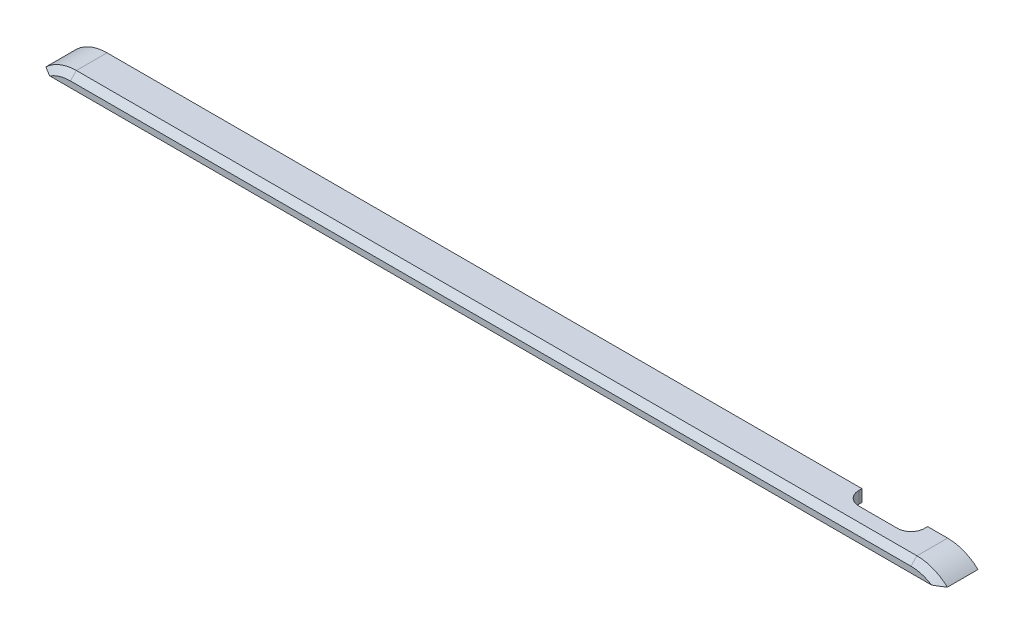
ISO-10303-21;
HEADER;
FILE_DESCRIPTION(('STEP AP214'),'2;1');
FILE_NAME('part.step','',(''),(''),'','','');
FILE_SCHEMA(('AUTOMOTIVE_DESIGN { 1 0 10303 214 1 1 1 1 }'));
ENDSEC;
DATA;
#1=APPLICATION_CONTEXT('core data for automotive mechanical design processes');
#2=APPLICATION_PROTOCOL_DEFINITION('international standard','automotive_design',2000,#1);
#3=PRODUCT_CONTEXT('',#1,'mechanical');
#4=PRODUCT('Part','Part','',(#3));
#5=PRODUCT_RELATED_PRODUCT_CATEGORY('part','',(#4));
#6=PRODUCT_DEFINITION_FORMATION('','',#4);
#7=PRODUCT_DEFINITION_CONTEXT('part definition',#1,'design');
#8=PRODUCT_DEFINITION('design','',#6,#7);
#9=PRODUCT_DEFINITION_SHAPE('','',#8);
#10=(LENGTH_UNIT() NAMED_UNIT(*) SI_UNIT(.MILLI.,.METRE.));
#11=(NAMED_UNIT(*) PLANE_ANGLE_UNIT() SI_UNIT($,.RADIAN.));
#12=(NAMED_UNIT(*) SI_UNIT($,.STERADIAN.) SOLID_ANGLE_UNIT());
#13=UNCERTAINTY_MEASURE_WITH_UNIT(LENGTH_MEASURE(1.E-05),#10,'distance_accuracy_value','');
#14=(GEOMETRIC_REPRESENTATION_CONTEXT(3) GLOBAL_UNCERTAINTY_ASSIGNED_CONTEXT((#13)) GLOBAL_UNIT_ASSIGNED_CONTEXT((#10,
#11,#12)) REPRESENTATION_CONTEXT('',''));
#15=CARTESIAN_POINT('',(0.,0.,0.));
#16=DIRECTION('',(0.,0.,1.));
#17=DIRECTION('',(1.,0.,0.));
#18=AXIS2_PLACEMENT_3D('',#15,#16,#17);
#19=CARTESIAN_POINT('',(-13.48999964809,95.544999648097,2.9));
#20=DIRECTION('',(0.,0.,1.));
#21=DIRECTION('',(1.,0.,0.));
#22=AXIS2_PLACEMENT_3D('',#19,#20,#21);
#23=CYLINDRICAL_SURFACE('',#22,7.40000035190612);
#24=DIRECTION('',(0.,0.,1.));
#25=VECTOR('',#24,1.);
#26=CARTESIAN_POINT('',(-18.549644043465,100.945000000001,2.9));
#27=LINE('',#26,#25);
#28=CARTESIAN_POINT('',(-18.549644043465,100.945000000001,3.09999999999999));
#29=VERTEX_POINT('',#28);
#30=CARTESIAN_POINT('',(-18.549644043465,100.945000000001,-2.));
#31=VERTEX_POINT('',#30);
#32=EDGE_CURVE('E72',#29,#31,#27,.F.);
#33=ORIENTED_EDGE('',*,*,#32,.F.);
#34=CARTESIAN_POINT('',(-13.48999964809,95.544999648097,3.09999999999999));
#35=DIRECTION('',(0.,0.,1.));
#36=DIRECTION('',(1.,0.,0.));
#37=AXIS2_PLACEMENT_3D('',#34,#35,#36);
#38=CIRCLE('',#37,7.40000035190612);
#39=CARTESIAN_POINT('',(-13.490000824045,102.945000000001,3.09999999999999));
#40=VERTEX_POINT('',#39);
#41=EDGE_CURVE('E225',#29,#40,#38,.F.);
#42=ORIENTED_EDGE('',*,*,#41,.T.);
#43=DIRECTION('',(0.,0.,1.));
#44=VECTOR('',#43,1.);
#45=CARTESIAN_POINT('',(-13.490000824045,102.945000000001,2.9));
#46=LINE('',#45,#44);
#47=CARTESIAN_POINT('',(-13.490000824045,102.945000000001,-2.));
#48=VERTEX_POINT('',#47);
#49=EDGE_CURVE('E207',#48,#40,#46,.T.);
#50=ORIENTED_EDGE('',*,*,#49,.F.);
#51=CARTESIAN_POINT('',(-13.48999964809,95.544999648097,-2.));
#52=DIRECTION('',(0.,0.,-1.));
#53=DIRECTION('',(-1.,0.,0.));
#54=AXIS2_PLACEMENT_3D('',#51,#52,#53);
#55=CIRCLE('',#54,7.40000035190612);
#56=EDGE_CURVE('E204',#48,#31,#55,.F.);
#57=ORIENTED_EDGE('',*,*,#56,.T.);
#58=EDGE_LOOP('',(#33,#42,#50,#57));
#59=FACE_BOUND('',#58,.T.);
#60=ADVANCED_FACE('F49',(#59),#23,.T.);
#61=CARTESIAN_POINT('',(126.37999964809,101.945000000001,4.1));
#62=DIRECTION('',(0.,-0.707106781186546,-0.707106781186549));
#63=DIRECTION('',(-1.,0.,0.));
#64=AXIS2_PLACEMENT_3D('',#61,#62,#63);
#65=PLANE('',#64);
#66=DIRECTION('',(0.,0.70710678118669,-0.707106781186405));
#67=VECTOR('',#66,1.);
#68=CARTESIAN_POINT('',(126.380005863851,101.944999999999,4.1));
#69=LINE('',#68,#67);
#70=CARTESIAN_POINT('',(126.380005863851,101.944999999999,4.1));
#71=VERTEX_POINT('',#70);
#72=CARTESIAN_POINT('',(126.380005863851,102.944999999999,3.09999999999999));
#73=VERTEX_POINT('',#72);
#74=EDGE_CURVE('E233',#71,#73,#69,.T.);
#75=ORIENTED_EDGE('',*,*,#74,.T.);
#76=DIRECTION('',(1.,0.,0.));
#77=VECTOR('',#76,1.);
#78=CARTESIAN_POINT('',(111.58999933321,102.945000000001,3.09999999999999));
#79=LINE('',#78,#77);
#80=EDGE_CURVE('E222',#40,#73,#79,.T.);
#81=ORIENTED_EDGE('',*,*,#80,.F.);
#82=DIRECTION('',(0.,-0.707106781186557,0.707106781186538));
#83=VECTOR('',#82,1.);
#84=CARTESIAN_POINT('',(-13.490000824045,102.945000000003,3.09999999999999));
#85=LINE('',#84,#83);
#86=CARTESIAN_POINT('',(-13.490000824045,101.945000000003,4.1));
#87=VERTEX_POINT('',#86);
#88=EDGE_CURVE('E231',#40,#87,#85,.T.);
#89=ORIENTED_EDGE('',*,*,#88,.T.);
#90=DIRECTION('',(-1.,0.,0.));
#91=VECTOR('',#90,1.);
#92=CARTESIAN_POINT('',(126.37999964809,101.945000000001,4.1));
#93=LINE('',#92,#91);
#94=EDGE_CURVE('E219',#71,#87,#93,.T.);
#95=ORIENTED_EDGE('',*,*,#94,.F.);
#96=EDGE_LOOP('',(#75,#81,#89,#95));
#97=FACE_BOUND('',#96,.T.);
#98=ADVANCED_FACE('F253',(#97),#65,.F.);
#99=CARTESIAN_POINT('',(126.37999964809,95.544999648097,4.1));
#100=DIRECTION('',(0.,0.,1.));
#101=DIRECTION('',(1.,0.,0.));
#102=AXIS2_PLACEMENT_3D('',#99,#100,#101);
#103=PLANE('',#102);
#104=DIRECTION('',(-1.,0.,0.));
#105=VECTOR('',#104,1.);
#106=CARTESIAN_POINT('',(126.37999964809,100.945000000001,4.1));
#107=LINE('',#106,#105);
#108=CARTESIAN_POINT('',(129.815112557999,100.945000000001,4.1));
#109=VERTEX_POINT('',#108);
#110=CARTESIAN_POINT('',(-16.925112558001,100.945000000001,4.1));
#111=VERTEX_POINT('',#110);
#112=EDGE_CURVE('E240',#109,#111,#107,.T.);
#113=ORIENTED_EDGE('',*,*,#112,.F.);
#114=CARTESIAN_POINT('',(126.37999964809,95.544999648097,4.1));
#115=DIRECTION('',(0.,0.,1.));
#116=DIRECTION('',(1.,0.,0.));
#117=AXIS2_PLACEMENT_3D('',#114,#115,#116);
#118=CIRCLE('',#117,6.40000035190484);
#119=EDGE_CURVE('E214',#109,#71,#118,.T.);
#120=ORIENTED_EDGE('',*,*,#119,.T.);
#121=ORIENTED_EDGE('',*,*,#94,.T.);
#122=CARTESIAN_POINT('',(-13.48999964809,95.544999648097,4.1));
#123=DIRECTION('',(0.,0.,1.));
#124=DIRECTION('',(1.,0.,0.));
#125=AXIS2_PLACEMENT_3D('',#122,#123,#124);
#126=CIRCLE('',#125,6.40000035190612);
#127=EDGE_CURVE('E216',#87,#111,#126,.T.);
#128=ORIENTED_EDGE('',*,*,#127,.T.);
#129=EDGE_LOOP('',(#113,#120,#121,#128));
#130=FACE_BOUND('',#129,.T.);
#131=ADVANCED_FACE('F252',(#130),#103,.T.);
#132=CARTESIAN_POINT('',(-13.48999964809,95.544999648097,4.1));
#133=DIRECTION('',(0.,0.,-1.));
#134=DIRECTION('',(-1.,0.,0.));
#135=AXIS2_PLACEMENT_3D('',#132,#133,#134);
#136=CONICAL_SURFACE('',#135,6.40000035190612,0.785398163397452);
#137=CARTESIAN_POINT('',(-13.48929964809,100.945000000001,5.09999995463193));
#138=CARTESIAN_POINT('',(-13.5723340239476,100.945000000001,5.10001741301453));
#139=CARTESIAN_POINT('',(-13.6553563848465,100.945000000001,5.0981053261214));
#140=CARTESIAN_POINT('',(-13.8212134919952,100.945000000001,5.09048485272498));
#141=CARTESIAN_POINT('',(-13.9040482667429,100.945000000001,5.08477708796652));
#142=CARTESIAN_POINT('',(-14.1517148026676,100.945000000001,5.06208572213213));
#143=CARTESIAN_POINT('',(-14.3160634607567,100.945000000001,5.03953355826812));
#144=CARTESIAN_POINT('',(-14.6394074650945,100.945000000001,4.9812824204309));
#145=CARTESIAN_POINT('',(-14.7984462173114,100.945000000001,4.94581838595187));
#146=CARTESIAN_POINT('',(-15.1134985070657,100.945000000001,4.86327890678816));
#147=CARTESIAN_POINT('',(-15.2695110092508,100.945000000001,4.81619956124987));
#148=CARTESIAN_POINT('',(-15.699646349075,100.945000000001,4.67118810812804));
#149=CARTESIAN_POINT('',(-15.9701030733297,100.945000000001,4.56239247421175));
#150=CARTESIAN_POINT('',(-16.5009476497338,100.945000000001,4.32184741264328));
#151=CARTESIAN_POINT('',(-16.7613139331218,100.945000000001,4.19005180804487));
#152=CARTESIAN_POINT('',(-17.1494830841682,100.945000000001,3.97775843432015));
#153=CARTESIAN_POINT('',(-17.2806029024924,100.945000000001,3.90321147804249));
#154=CARTESIAN_POINT('',(-17.5406830410027,100.945000000001,3.75041175910294));
#155=CARTESIAN_POINT('',(-17.669643179831,100.945000000001,3.67215868731345));
#156=CARTESIAN_POINT('',(-17.9249489206495,100.945000000001,3.51295062343005));
#157=CARTESIAN_POINT('',(-18.0513046021738,100.945000000001,3.43201171750743));
#158=CARTESIAN_POINT('',(-18.3022503859577,100.945000000001,3.26751481699084));
#159=CARTESIAN_POINT('',(-18.426840977559,100.945000000001,3.18395756977061));
#160=CARTESIAN_POINT('',(-18.550667775733,100.945000000001,3.09929999999999));
#161=B_SPLINE_CURVE_WITH_KNOTS('',3,(#137,#138,#139,#140,#141,#142,#143,#144,#145,#146,#147,
#148,#149,#150,#151,#152,#153,#154,#155,#156,#157,#158,#159,#160),.UNSPECIFIED.,.F.,.F.,(4,2,2,
2,2,2,2,2,2,2,2,4),(0.,0.249057434237259,0.498074082072483,0.995047337088851,1.4833961927251,
1.97190927785905,2.84484244812389,3.71954880037798,4.17198837475361,4.62446575387136,
5.07460052315841,5.52460795678513),.UNSPECIFIED.);
#162=EDGE_CURVE('E11',#111,#29,#161,.T.);
#163=ORIENTED_EDGE('',*,*,#162,.F.);
#164=ORIENTED_EDGE('',*,*,#127,.F.);
#165=ORIENTED_EDGE('',*,*,#88,.F.);
#166=ORIENTED_EDGE('',*,*,#41,.F.);
#167=EDGE_LOOP('',(#163,#164,#165,#166));
#168=FACE_BOUND('',#167,.T.);
#169=ADVANCED_FACE('F243',(#168),#136,.T.);
#170=CARTESIAN_POINT('',(126.37999964809,95.544999648097,2.9));
#171=DIRECTION('',(0.,0.,1.));
#172=DIRECTION('',(1.,0.,0.));
#173=AXIS2_PLACEMENT_3D('',#170,#171,#172);
#174=CYLINDRICAL_SURFACE('',#173,7.40000035190483);
#175=DIRECTION('',(0.,0.,1.));
#176=VECTOR('',#175,1.);
#177=CARTESIAN_POINT('',(131.439644043463,100.945000000001,2.9));
#178=LINE('',#177,#176);
#179=CARTESIAN_POINT('',(131.439644043463,100.945000000001,-2.));
#180=VERTEX_POINT('',#179);
#181=CARTESIAN_POINT('',(131.439644043463,100.945000000001,3.09999999999999));
#182=VERTEX_POINT('',#181);
#183=EDGE_CURVE('E281',#180,#182,#178,.T.);
#184=ORIENTED_EDGE('',*,*,#183,.F.);
#185=CARTESIAN_POINT('',(126.37999964809,95.544999648097,-2.));
#186=DIRECTION('',(0.,0.,-1.));
#187=DIRECTION('',(-1.,0.,0.));
#188=AXIS2_PLACEMENT_3D('',#185,#186,#187);
#189=CIRCLE('',#188,7.40000035190483);
#190=CARTESIAN_POINT('',(126.380005863851,102.944999999999,-2.));
#191=VERTEX_POINT('',#190);
#192=EDGE_CURVE('E199',#180,#191,#189,.F.);
#193=ORIENTED_EDGE('',*,*,#192,.T.);
#194=DIRECTION('',(0.,0.,1.));
#195=VECTOR('',#194,1.);
#196=CARTESIAN_POINT('',(126.380005863851,102.944999999999,2.9));
#197=LINE('',#196,#195);
#198=EDGE_CURVE('E206',#191,#73,#197,.T.);
#199=ORIENTED_EDGE('',*,*,#198,.T.);
#200=CARTESIAN_POINT('',(126.37999964809,95.544999648097,3.09999999999999));
#201=DIRECTION('',(0.,0.,1.));
#202=DIRECTION('',(1.,0.,0.));
#203=AXIS2_PLACEMENT_3D('',#200,#201,#202);
#204=CIRCLE('',#203,7.40000035190483);
#205=EDGE_CURVE('E227',#73,#182,#204,.F.);
#206=ORIENTED_EDGE('',*,*,#205,.T.);
#207=EDGE_LOOP('',(#184,#193,#199,#206));
#208=FACE_BOUND('',#207,.T.);
#209=ADVANCED_FACE('F251',(#208),#174,.T.);
#210=CARTESIAN_POINT('',(126.37999964809,95.544999648097,4.1));
#211=DIRECTION('',(0.,0.,-1.));
#212=DIRECTION('',(-1.,0.,0.));
#213=AXIS2_PLACEMENT_3D('',#210,#211,#212);
#214=CONICAL_SURFACE('',#213,6.40000035190484,0.785398163397444);
#215=CARTESIAN_POINT('',(131.440667775731,100.945000000001,3.09929999999999));
#216=CARTESIAN_POINT('',(131.311640556978,100.945000000001,3.18750998571934));
#217=CARTESIAN_POINT('',(131.181784264701,100.945000000001,3.27452928016106));
#218=CARTESIAN_POINT('',(130.920141631536,100.945000000001,3.44570924997212));
#219=CARTESIAN_POINT('',(130.788354662338,100.945000000001,3.52986896376832));
#220=CARTESIAN_POINT('',(130.521816032127,100.945000000001,3.69531972920066));
#221=CARTESIAN_POINT('',(130.387050812795,100.945000000001,3.77658902883069));
#222=CARTESIAN_POINT('',(130.115136420347,100.945000000001,3.93501488482023));
#223=CARTESIAN_POINT('',(129.977987485879,100.945000000001,4.01217184978255));
#224=CARTESIAN_POINT('',(129.705962817638,100.945000000001,4.15891248857676));
#225=CARTESIAN_POINT('',(129.571180629695,100.945000000001,4.22866816678893));
#226=CARTESIAN_POINT('',(129.29893478891,100.945000000001,4.36272527308874));
#227=CARTESIAN_POINT('',(129.161470827002,100.945000000001,4.42702606789407));
#228=CARTESIAN_POINT('',(128.745392485295,100.945000000001,4.60991463231486));
#229=CARTESIAN_POINT('',(128.462327441611,100.945000000001,4.71891350463834));
#230=CARTESIAN_POINT('',(128.029849613404,100.945000000001,4.85523102855839));
#231=CARTESIAN_POINT('',(127.884663157032,100.945000000001,4.8960875356603));
#232=CARTESIAN_POINT('',(127.591773378286,100.945000000001,4.96752926444502));
#233=CARTESIAN_POINT('',(127.444070470123,100.945000000001,4.99811615967446));
#234=CARTESIAN_POINT('',(127.144196618381,100.945000000001,5.04822884049862));
#235=CARTESIAN_POINT('',(126.991992329336,100.945000000001,5.06755944964926));
#236=CARTESIAN_POINT('',(126.762795620414,100.945000000001,5.0869869311034));
#237=CARTESIAN_POINT('',(126.686186541495,100.945000000001,5.0918680849267));
#238=CARTESIAN_POINT('',(126.532821323636,100.945000000001,5.09838220241893));
#239=CARTESIAN_POINT('',(126.456065167883,100.945000000001,5.10001476943573));
#240=CARTESIAN_POINT('',(126.37929964809,100.945000000001,5.09999995463062));
#241=B_SPLINE_CURVE_WITH_KNOTS('',3,(#215,#216,#217,#218,#219,#220,#221,#222,#223,#224,#225,
#226,#227,#228,#229,#230,#231,#232,#233,#234,#235,#236,#237,#238,#239,#240),.UNSPECIFIED.,.F.,
.F.,(4,2,2,2,2,2,2,2,2,2,2,2,4),(0.,0.468905252380911,0.937966650776956,1.4100235481305,
1.88203345399205,2.33719862448713,2.79241656507596,3.70023655413355,4.15241390494521,
4.60451753265921,5.06424331038149,5.29447577804245,5.52473635534141),.UNSPECIFIED.);
#242=EDGE_CURVE('E58',#182,#109,#241,.T.);
#243=ORIENTED_EDGE('',*,*,#242,.F.);
#244=ORIENTED_EDGE('',*,*,#205,.F.);
#245=ORIENTED_EDGE('',*,*,#74,.F.);
#246=ORIENTED_EDGE('',*,*,#119,.F.);
#247=EDGE_LOOP('',(#243,#244,#245,#246));
#248=FACE_BOUND('',#247,.T.);
#249=ADVANCED_FACE('F255',(#248),#214,.T.);
#250=CARTESIAN_POINT('',(0.,82.3491660064344,0.764999999999987));
#251=DIRECTION('',(0.,0.,1.));
#252=DIRECTION('',(1.,0.,0.));
#253=AXIS2_PLACEMENT_3D('',#250,#251,#252);
#254=PLANE('',#253);
#255=DIRECTION('',(0.,1.,0.));
#256=VECTOR('',#255,1.);
#257=CARTESIAN_POINT('',(114.370000000025,82.3491660064344,0.764999999999977));
#258=LINE('',#257,#256);
#259=CARTESIAN_POINT('',(114.370000000025,100.945000000002,0.764999999999977));
#260=VERTEX_POINT('',#259);
#261=CARTESIAN_POINT('',(114.370000000025,102.94499999996,0.764999999999977));
#262=VERTEX_POINT('',#261);
#263=EDGE_CURVE('E163',#260,#262,#258,.T.);
#264=ORIENTED_EDGE('',*,*,#263,.T.);
#265=DIRECTION('',(1.,1.50756392520579E-12,0.));
#266=VECTOR('',#265,1.);
#267=CARTESIAN_POINT('',(1.82353062601583E-11,102.944999999783,0.764999999999987));
#268=LINE('',#267,#266);
#269=CARTESIAN_POINT('',(120.810000000025,102.944999999962,0.764999999999977));
#270=VERTEX_POINT('',#269);
#271=EDGE_CURVE('E166',#262,#270,#268,.T.);
#272=ORIENTED_EDGE('',*,*,#271,.T.);
#273=DIRECTION('',(0.,1.,0.));
#274=VECTOR('',#273,1.);
#275=CARTESIAN_POINT('',(120.810000000025,82.3491660064344,0.764999999999977));
#276=LINE('',#275,#274);
#277=CARTESIAN_POINT('',(120.810000000025,100.945000000002,0.764999999999977));
#278=VERTEX_POINT('',#277);
#279=EDGE_CURVE('E152',#278,#270,#276,.T.);
#280=ORIENTED_EDGE('',*,*,#279,.F.);
#281=DIRECTION('',(1.,3.05311352129676E-13,0.));
#282=VECTOR('',#281,1.);
#283=CARTESIAN_POINT('',(122.589999999998,100.945000000003,0.764999999999988));
#284=LINE('',#283,#282);
#285=EDGE_CURVE('E212',#260,#278,#284,.T.);
#286=ORIENTED_EDGE('',*,*,#285,.F.);
#287=EDGE_LOOP('',(#264,#272,#280,#286));
#288=FACE_BOUND('',#287,.T.);
#289=ADVANCED_FACE('F167',(#288),#254,.F.);
#290=CARTESIAN_POINT('',(111.58999933321,102.945000000001,2.9));
#291=DIRECTION('',(0.,1.,0.));
#292=DIRECTION('',(-1.,0.,0.));
#293=AXIS2_PLACEMENT_3D('',#290,#291,#292);
#294=PLANE('',#293);
#295=ORIENTED_EDGE('',*,*,#49,.T.);
#296=ORIENTED_EDGE('',*,*,#80,.T.);
#297=ORIENTED_EDGE('',*,*,#198,.F.);
#298=DIRECTION('',(-1.,0.,0.));
#299=VECTOR('',#298,1.);
#300=CARTESIAN_POINT('',(0.,102.945000000001,-2.));
#301=LINE('',#300,#299);
#302=CARTESIAN_POINT('',(123.060000000025,102.944999999968,-2.));
#303=VERTEX_POINT('',#302);
#304=EDGE_CURVE('E202',#191,#303,#301,.T.);
#305=ORIENTED_EDGE('',*,*,#304,.T.);
#306=DIRECTION('',(0.,0.,-1.));
#307=VECTOR('',#306,1.);
#308=CARTESIAN_POINT('',(123.060000000025,102.944999999968,0.));
#309=LINE('',#308,#307);
#310=CARTESIAN_POINT('',(123.060000000025,102.944999999968,-1.48500000000002));
#311=VERTEX_POINT('',#310);
#312=EDGE_CURVE('E178',#311,#303,#309,.T.);
#313=ORIENTED_EDGE('',*,*,#312,.F.);
#314=CARTESIAN_POINT('',(120.810000000025,102.944999999965,-1.48500000000002));
#315=DIRECTION('',(-1.50756392520579E-12,1.,0.));
#316=DIRECTION('',(-1.,-1.50756392520579E-12,0.));
#317=AXIS2_PLACEMENT_3D('',#314,#315,#316);
#318=CIRCLE('',#317,2.25);
#319=EDGE_CURVE('E157',#270,#311,#318,.T.);
#320=ORIENTED_EDGE('',*,*,#319,.F.);
#321=ORIENTED_EDGE('',*,*,#271,.F.);
#322=CARTESIAN_POINT('',(114.370000000025,102.944999999955,-1.48500000000002));
#323=DIRECTION('',(-1.50756392520579E-12,1.,0.));
#324=DIRECTION('',(-1.,-1.50756392520579E-12,0.));
#325=AXIS2_PLACEMENT_3D('',#322,#323,#324);
#326=CIRCLE('',#325,2.25);
#327=CARTESIAN_POINT('',(112.120000000025,102.944999999952,-1.48500000000002));
#328=VERTEX_POINT('',#327);
#329=EDGE_CURVE('E173',#328,#262,#326,.T.);
#330=ORIENTED_EDGE('',*,*,#329,.F.);
#331=DIRECTION('',(0.,0.,1.));
#332=VECTOR('',#331,1.);
#333=CARTESIAN_POINT('',(112.120000000025,102.944999999952,0.));
#334=LINE('',#333,#332);
#335=CARTESIAN_POINT('',(112.120000000025,102.944999999952,-2.));
#336=VERTEX_POINT('',#335);
#337=EDGE_CURVE('E181',#336,#328,#334,.T.);
#338=ORIENTED_EDGE('',*,*,#337,.F.);
#339=EDGE_CURVE('E201',#336,#48,#301,.T.);
#340=ORIENTED_EDGE('',*,*,#339,.T.);
#341=EDGE_LOOP('',(#295,#296,#297,#305,#313,#320,#321,#330,#338,#340));
#342=FACE_BOUND('',#341,.T.);
#343=ADVANCED_FACE('F176',(#342),#294,.T.);
#344=CARTESIAN_POINT('',(120.810000000025,82.3491660064344,-1.48500000000002));
#345=DIRECTION('',(0.,1.,0.));
#346=DIRECTION('',(0.,0.,1.));
#347=AXIS2_PLACEMENT_3D('',#344,#345,#346);
#348=CYLINDRICAL_SURFACE('',#347,2.25);
#349=DIRECTION('',(0.,1.,0.));
#350=VECTOR('',#349,1.);
#351=CARTESIAN_POINT('',(123.060000000025,82.3491660064344,-1.48500000000002));
#352=LINE('',#351,#350);
#353=CARTESIAN_POINT('',(123.060000000025,100.945000000001,-1.48500000000002));
#354=VERTEX_POINT('',#353);
#355=EDGE_CURVE('E162',#354,#311,#352,.T.);
#356=ORIENTED_EDGE('',*,*,#355,.F.);
#357=CARTESIAN_POINT('',(120.810000000025,100.945000000003,-1.48500000000002));
#358=DIRECTION('',(-3.05311352129676E-13,1.,0.));
#359=DIRECTION('',(-1.,-3.05311352129676E-13,0.));
#360=AXIS2_PLACEMENT_3D('',#357,#358,#359);
#361=CIRCLE('',#360,2.25);
#362=EDGE_CURVE('E159',#278,#354,#361,.T.);
#363=ORIENTED_EDGE('',*,*,#362,.F.);
#364=ORIENTED_EDGE('',*,*,#279,.T.);
#365=ORIENTED_EDGE('',*,*,#319,.T.);
#366=EDGE_LOOP('',(#356,#363,#364,#365));
#367=FACE_BOUND('',#366,.T.);
#368=ADVANCED_FACE('F155',(#367),#348,.F.);
#369=CARTESIAN_POINT('',(0.,0.,-2.));
#370=DIRECTION('',(0.,0.,-1.));
#371=DIRECTION('',(-1.,0.,0.));
#372=AXIS2_PLACEMENT_3D('',#369,#370,#371);
#373=PLANE('',#372);
#374=DIRECTION('',(1.,0.,0.));
#375=VECTOR('',#374,1.);
#376=CARTESIAN_POINT('',(0.,100.945000000001,-2.));
#377=LINE('',#376,#375);
#378=CARTESIAN_POINT('',(123.060000000025,100.945000000001,-2.));
#379=VERTEX_POINT('',#378);
#380=EDGE_CURVE('E269',#379,#180,#377,.T.);
#381=ORIENTED_EDGE('',*,*,#380,.F.);
#382=DIRECTION('',(0.,-1.,0.));
#383=VECTOR('',#382,1.);
#384=CARTESIAN_POINT('',(123.060000000025,0.,-2.));
#385=LINE('',#384,#383);
#386=EDGE_CURVE('E196',#303,#379,#385,.T.);
#387=ORIENTED_EDGE('',*,*,#386,.F.);
#388=ORIENTED_EDGE('',*,*,#304,.F.);
#389=ORIENTED_EDGE('',*,*,#192,.F.);
#390=EDGE_LOOP('',(#381,#387,#388,#389));
#391=FACE_BOUND('',#390,.T.);
#392=ADVANCED_FACE('F294',(#391),#373,.T.);
#393=CARTESIAN_POINT('',(123.060000000025,82.3491660064344,0.));
#394=DIRECTION('',(1.,0.,0.));
#395=DIRECTION('',(0.,0.,-1.));
#396=AXIS2_PLACEMENT_3D('',#393,#394,#395);
#397=PLANE('',#396);
#398=ORIENTED_EDGE('',*,*,#386,.T.);
#399=DIRECTION('',(0.,0.,1.));
#400=VECTOR('',#399,1.);
#401=CARTESIAN_POINT('',(123.060000000025,100.945000000001,0.));
#402=LINE('',#401,#400);
#403=EDGE_CURVE('E280',#379,#354,#402,.T.);
#404=ORIENTED_EDGE('',*,*,#403,.T.);
#405=ORIENTED_EDGE('',*,*,#355,.T.);
#406=ORIENTED_EDGE('',*,*,#312,.T.);
#407=EDGE_LOOP('',(#398,#404,#405,#406));
#408=FACE_BOUND('',#407,.T.);
#409=ADVANCED_FACE('F289',(#408),#397,.F.);
#410=CARTESIAN_POINT('',(56.4449957534975,99.9449999999518,1.00857997860453));
#411=DIRECTION('',(0.,0.,-1.));
#412=DIRECTION('',(-1.,0.,0.));
#413=AXIS2_PLACEMENT_3D('',#410,#411,#412);
#414=CONICAL_SURFACE('',#413,1.65,1.02974425867665);
#415=CARTESIAN_POINT('',(56.4449957534975,99.9449999999518,1.00857997860453));
#416=DIRECTION('',(0.,0.,-1.));
#417=DIRECTION('',(-1.,0.,0.));
#418=AXIS2_PLACEMENT_3D('',#415,#416,#417);
#419=CIRCLE('',#418,1.65);
#420=CARTESIAN_POINT('',(55.1325552786942,100.945000000001,1.00857997860453));
#421=VERTEX_POINT('',#420);
#422=CARTESIAN_POINT('',(57.7574362283008,100.945000000001,1.00857997860453));
#423=VERTEX_POINT('',#422);
#424=EDGE_CURVE('E179',#421,#423,#419,.T.);
#425=ORIENTED_EDGE('',*,*,#424,.T.);
#426=CARTESIAN_POINT('',(61.540905210028,100.945000000001,-1.1203296034421));
#427=CARTESIAN_POINT('',(61.3304770411835,100.945000000001,-0.996292640783176));
#428=CARTESIAN_POINT('',(61.1199512776396,100.945000000001,-0.872418749741885));
#429=CARTESIAN_POINT('',(60.6985066926326,100.945000000001,-0.625292180217068));
#430=CARTESIAN_POINT('',(60.487587833126,100.945000000001,-0.502039566648309));
#431=CARTESIAN_POINT('',(60.0661127097373,100.945000000001,-0.257005489159661));
#432=CARTESIAN_POINT('',(59.8555588028768,100.945000000001,-0.135219973643991));
#433=CARTESIAN_POINT('',(59.4335782905611,100.945000000001,0.106806235829771));
#434=CARTESIAN_POINT('',(59.222151742585,100.945000000001,0.227047029455834));
#435=CARTESIAN_POINT('',(58.8975677062341,100.945000000001,0.408741822176247));
#436=CARTESIAN_POINT('',(58.7849903994738,100.945000000001,0.471230672337831));
#437=CARTESIAN_POINT('',(58.5591654040846,100.945000000001,0.595019771317033));
#438=CARTESIAN_POINT('',(58.445917644386,100.945000000001,0.656319891070957));
#439=CARTESIAN_POINT('',(58.217999026741,100.945000000001,0.77732913472276));
#440=CARTESIAN_POINT('',(58.1033243140817,100.945000000001,0.837031016090534));
#441=CARTESIAN_POINT('',(57.872474953333,100.945000000001,0.953450842283556));
#442=CARTESIAN_POINT('',(57.7563006404482,100.945000000001,1.01016944005293));
#443=CARTESIAN_POINT('',(57.5733611001153,100.945000000001,1.0944194858479));
#444=CARTESIAN_POINT('',(57.5074414338282,100.945000000001,1.12377556080311));
#445=CARTESIAN_POINT('',(57.3745992289792,100.945000000001,1.18010869767032));
#446=CARTESIAN_POINT('',(57.3076769309689,100.945000000001,1.20708631985733));
#447=CARTESIAN_POINT('',(57.1728836196772,100.945000000001,1.25749318673302));
#448=CARTESIAN_POINT('',(57.1050192958628,100.945000000001,1.28094004717973));
#449=CARTESIAN_POINT('',(56.9677702222358,100.945000000001,1.32291390278265));
#450=CARTESIAN_POINT('',(56.8983862904019,100.945000000001,1.34144347763436));
#451=CARTESIAN_POINT('',(56.7765057802301,100.945000000001,1.36764707551995));
#452=CARTESIAN_POINT('',(56.7243531706941,100.945000000001,1.37689364053142));
#453=CARTESIAN_POINT('',(56.6194445076789,100.945000000001,1.39083805154688));
#454=CARTESIAN_POINT('',(56.5666887043308,100.945000000001,1.39553771843736));
#455=CARTESIAN_POINT('',(56.4610242229491,100.945000000001,1.39989525550351));
#456=CARTESIAN_POINT('',(56.4081157991466,100.945000000001,1.39955907537951));
#457=CARTESIAN_POINT('',(56.3025645147101,100.945000000001,1.39389956045539));
#458=CARTESIAN_POINT('',(56.2499217264758,100.945000000001,1.38857493281918));
#459=CARTESIAN_POINT('',(56.1219405518548,100.945000000001,1.37010675564803));
#460=CARTESIAN_POINT('',(56.0469574512381,100.945000000001,1.35453435850218));
#461=CARTESIAN_POINT('',(55.8987554794984,100.945000000001,1.3165360900463));
#462=CARTESIAN_POINT('',(55.825538673695,100.945000000001,1.2941025788831));
#463=CARTESIAN_POINT('',(55.6793315094066,100.945000000001,1.24411827455683));
#464=CARTESIAN_POINT('',(55.6063726625239,100.945000000001,1.2164772572826));
#465=CARTESIAN_POINT('',(55.4979522990332,100.945000000001,1.17260259238647));
#466=CARTESIAN_POINT('',(55.4619891508909,100.945000000001,1.15757886583842));
#467=CARTESIAN_POINT('',(55.3903517816277,100.945000000001,1.12685938101184));
#468=CARTESIAN_POINT('',(55.3546775504459,100.945000000001,1.11116364625514));
#469=CARTESIAN_POINT('',(55.2263313094056,100.945000000001,1.05351214089009));
#470=CARTESIAN_POINT('',(55.1343745851242,100.945000000001,1.00996704634981));
#471=CARTESIAN_POINT('',(54.9515964998823,100.945000000001,0.920547336024349));
#472=CARTESIAN_POINT('',(54.8607753553545,100.945000000001,0.874672284353943));
#473=CARTESIAN_POINT('',(54.6798871171551,100.945000000001,0.781354731440621));
#474=CARTESIAN_POINT('',(54.5898204202705,100.945000000001,0.733911463245977));
#475=CARTESIAN_POINT('',(54.4102576704599,100.945000000001,0.637955071196428));
#476=CARTESIAN_POINT('',(54.3207616348551,100.945000000001,0.589441915064818));
#477=CARTESIAN_POINT('',(54.0525623732657,100.945000000001,0.442595163092215));
#478=CARTESIAN_POINT('',(53.8744803113751,100.945000000001,0.343129025608467));
#479=CARTESIAN_POINT('',(53.5193120589391,100.945000000001,0.142570563589434));
#480=CARTESIAN_POINT('',(53.3422255818564,100.945000000001,0.0414787430825395));
#481=CARTESIAN_POINT('',(53.0132464820998,100.945000000001,-0.14759905400944));
#482=CARTESIAN_POINT('',(52.8612769661132,100.945000000001,-0.235451323848294));
#483=CARTESIAN_POINT('',(52.5576319373696,100.945000000001,-0.411694795778203));
#484=CARTESIAN_POINT('',(52.4059564537591,100.945000000001,-0.500086048023634));
#485=CARTESIAN_POINT('',(52.1033141213713,100.945000000001,-0.676964868149635));
#486=CARTESIAN_POINT('',(51.9523465601113,100.945000000001,-0.76545121767954));
#487=CARTESIAN_POINT('',(51.6505953923959,100.945000000001,-0.942702191496481));
#488=CARTESIAN_POINT('',(51.4998117688746,100.945000000001,-1.03146678672384));
#489=CARTESIAN_POINT('',(51.349086296967,100.945000000001,-1.1203296034421));
#490=B_SPLINE_CURVE_WITH_KNOTS('',3,(#426,#427,#428,#429,#430,#431,#432,#433,#434,#435,#436,
#437,#438,#439,#440,#441,#442,#443,#444,#445,#446,#447,#448,#449,#450,#451,#452,#453,#454,#455,
#456,#457,#458,#459,#460,#461,#462,#463,#464,#465,#466,#467,#468,#469,#470,#471,#472,#473,#474,
#475,#476,#477,#478,#479,#480,#481,#482,#483,#484,#485,#486,#487,#488,#489),.UNSPECIFIED.,.F.,
.F.,(4,2,2,2,2,2,2,2,2,2,2,2,2,2,2,2,2,2,2,2,2,2,2,2,2,2,2,2,2,2,2,4),(0.,0.732795713831818,
1.46566647012485,2.1953776679264,2.92504154468898,3.31130998404197,3.69762012942186,
4.08545650912919,4.47320764775077,4.68965942544086,4.90606007814388,5.1213424869423,
5.33651173048121,5.4952440928922,5.65391286175139,5.81239418307872,5.9709165887446,
6.20017936306064,6.42969835677387,6.66363718029729,6.78055831026751,6.89747535106763,
7.20265010744245,7.50788216731397,7.81326577927087,8.11865861677058,8.73057049601261,
9.34229618162334,9.86890137539431,10.3955563432566,10.9205220303042,11.4454346049268),.UNSPECIFIED.);
#491=EDGE_CURVE('E273',#423,#421,#490,.T.);
#492=ORIENTED_EDGE('',*,*,#491,.T.);
#493=EDGE_LOOP('',(#425,#492));
#494=FACE_BOUND('',#493,.T.);
#495=ADVANCED_FACE('F283',(#494),#414,.F.);
#496=DIRECTION('',(1.,0.,0.));
#497=VECTOR('',#496,1.);
#498=CARTESIAN_POINT('',(0.,100.945000000001,-2.));
#499=LINE('',#498,#497);
#500=CARTESIAN_POINT('',(55.1325552786942,100.945000000001,-2.));
#501=VERTEX_POINT('',#500);
#502=EDGE_CURVE('E345',#31,#501,#499,.T.);
#503=ORIENTED_EDGE('',*,*,#502,.F.);
#504=ORIENTED_EDGE('',*,*,#56,.F.);
#505=ORIENTED_EDGE('',*,*,#339,.F.);
#506=DIRECTION('',(0.,1.,0.));
#507=VECTOR('',#506,1.);
#508=CARTESIAN_POINT('',(112.120000000025,0.,-2.));
#509=LINE('',#508,#507);
#510=CARTESIAN_POINT('',(112.120000000025,100.945000000001,-2.));
#511=VERTEX_POINT('',#510);
#512=EDGE_CURVE('E194',#511,#336,#509,.T.);
#513=ORIENTED_EDGE('',*,*,#512,.F.);
#514=CARTESIAN_POINT('',(57.7574362283008,100.945000000001,-2.));
#515=VERTEX_POINT('',#514);
#516=EDGE_CURVE('E270',#515,#511,#499,.T.);
#517=ORIENTED_EDGE('',*,*,#516,.F.);
#518=CARTESIAN_POINT('',(56.4449957534975,99.9449999999518,-2.));
#519=DIRECTION('',(0.,0.,-1.));
#520=DIRECTION('',(-1.,0.,0.));
#521=AXIS2_PLACEMENT_3D('',#518,#519,#520);
#522=CIRCLE('',#521,1.64999999999999);
#523=EDGE_CURVE('E184',#501,#515,#522,.T.);
#524=ORIENTED_EDGE('',*,*,#523,.F.);
#525=EDGE_LOOP('',(#503,#504,#505,#513,#517,#524));
#526=FACE_BOUND('',#525,.T.);
#527=ADVANCED_FACE('F288',(#526),#373,.T.);
#528=CARTESIAN_POINT('',(56.4449957534975,99.9449999999518,-2.));
#529=DIRECTION('',(0.,0.,-1.));
#530=DIRECTION('',(-1.,0.,0.));
#531=AXIS2_PLACEMENT_3D('',#528,#529,#530);
#532=CYLINDRICAL_SURFACE('',#531,1.65);
#533=ORIENTED_EDGE('',*,*,#523,.T.);
#534=DIRECTION('',(0.,0.,-1.));
#535=VECTOR('',#534,1.);
#536=CARTESIAN_POINT('',(57.7574362283008,100.945000000001,-2.));
#537=LINE('',#536,#535);
#538=EDGE_CURVE('E272',#515,#423,#537,.F.);
#539=ORIENTED_EDGE('',*,*,#538,.T.);
#540=ORIENTED_EDGE('',*,*,#424,.F.);
#541=DIRECTION('',(0.,0.,-1.));
#542=VECTOR('',#541,1.);
#543=CARTESIAN_POINT('',(55.1325552786942,100.945000000001,-2.));
#544=LINE('',#543,#542);
#545=EDGE_CURVE('E230',#421,#501,#544,.T.);
#546=ORIENTED_EDGE('',*,*,#545,.T.);
#547=EDGE_LOOP('',(#533,#539,#540,#546));
#548=FACE_BOUND('',#547,.T.);
#549=ADVANCED_FACE('F291',(#548),#532,.F.);
#550=CARTESIAN_POINT('',(114.370000000025,82.3491660064344,-1.48500000000002));
#551=DIRECTION('',(0.,1.,0.));
#552=DIRECTION('',(0.,0.,1.));
#553=AXIS2_PLACEMENT_3D('',#550,#551,#552);
#554=CYLINDRICAL_SURFACE('',#553,2.25);
#555=CARTESIAN_POINT('',(114.370000000025,100.945000000001,-1.48500000000002));
#556=DIRECTION('',(-3.05311352129676E-13,1.,0.));
#557=DIRECTION('',(-1.,-3.05311352129676E-13,0.));
#558=AXIS2_PLACEMENT_3D('',#555,#556,#557);
#559=CIRCLE('',#558,2.25);
#560=CARTESIAN_POINT('',(112.120000000025,100.945000000001,-1.48500000000002));
#561=VERTEX_POINT('',#560);
#562=EDGE_CURVE('E188',#561,#260,#559,.T.);
#563=ORIENTED_EDGE('',*,*,#562,.F.);
#564=DIRECTION('',(0.,1.,0.));
#565=VECTOR('',#564,1.);
#566=CARTESIAN_POINT('',(112.120000000025,82.3491660064344,-1.48500000000002));
#567=LINE('',#566,#565);
#568=EDGE_CURVE('E172',#561,#328,#567,.T.);
#569=ORIENTED_EDGE('',*,*,#568,.T.);
#570=ORIENTED_EDGE('',*,*,#329,.T.);
#571=ORIENTED_EDGE('',*,*,#263,.F.);
#572=EDGE_LOOP('',(#563,#569,#570,#571));
#573=FACE_BOUND('',#572,.T.);
#574=ADVANCED_FACE('F300',(#573),#554,.F.);
#575=CARTESIAN_POINT('',(112.120000000025,82.3491660064344,0.));
#576=DIRECTION('',(-1.,0.,0.));
#577=DIRECTION('',(0.,0.,1.));
#578=AXIS2_PLACEMENT_3D('',#575,#576,#577);
#579=PLANE('',#578);
#580=ORIENTED_EDGE('',*,*,#568,.F.);
#581=DIRECTION('',(0.,0.,-1.));
#582=VECTOR('',#581,1.);
#583=CARTESIAN_POINT('',(112.120000000025,100.945000000001,0.));
#584=LINE('',#583,#582);
#585=EDGE_CURVE('E53',#561,#511,#584,.T.);
#586=ORIENTED_EDGE('',*,*,#585,.T.);
#587=ORIENTED_EDGE('',*,*,#512,.T.);
#588=ORIENTED_EDGE('',*,*,#337,.T.);
#589=EDGE_LOOP('',(#580,#586,#587,#588));
#590=FACE_BOUND('',#589,.T.);
#591=ADVANCED_FACE('F303',(#590),#579,.F.);
#592=CARTESIAN_POINT('',(122.589999999998,100.945000000003,-201.926139944087));
#593=DIRECTION('',(-3.05311352129676E-13,1.,0.));
#594=DIRECTION('',(-1.,-3.05311352129676E-13,0.));
#595=AXIS2_PLACEMENT_3D('',#592,#593,#594);
#596=PLANE('',#595);
#597=ORIENTED_EDGE('',*,*,#585,.F.);
#598=ORIENTED_EDGE('',*,*,#562,.T.);
#599=ORIENTED_EDGE('',*,*,#285,.T.);
#600=ORIENTED_EDGE('',*,*,#362,.T.);
#601=ORIENTED_EDGE('',*,*,#403,.F.);
#602=ORIENTED_EDGE('',*,*,#380,.T.);
#603=ORIENTED_EDGE('',*,*,#183,.T.);
#604=ORIENTED_EDGE('',*,*,#242,.T.);
#605=ORIENTED_EDGE('',*,*,#112,.T.);
#606=ORIENTED_EDGE('',*,*,#162,.T.);
#607=ORIENTED_EDGE('',*,*,#32,.T.);
#608=ORIENTED_EDGE('',*,*,#502,.T.);
#609=ORIENTED_EDGE('',*,*,#545,.F.);
#610=ORIENTED_EDGE('',*,*,#491,.F.);
#611=ORIENTED_EDGE('',*,*,#538,.F.);
#612=ORIENTED_EDGE('',*,*,#516,.T.);
#613=EDGE_LOOP('',(#597,#598,#599,#600,#601,#602,#603,#604,#605,#606,#607,#608,#609,#610,#611,#612));
#614=FACE_BOUND('',#613,.T.);
#615=ADVANCED_FACE('F307',(#614),#596,.F.);
#616=CLOSED_SHELL('',(#60,#98,#131,#169,#209,#249,#289,#343,#368,#392,#409,#495,#527,#549,#574,
#591,#615));
#617=MANIFOLD_SOLID_BREP('B2',#616);
#618=ADVANCED_BREP_SHAPE_REPRESENTATION('',(#18,#617),#14);
#619=SHAPE_DEFINITION_REPRESENTATION(#9,#618);
ENDSEC;
END-ISO-10303-21;
